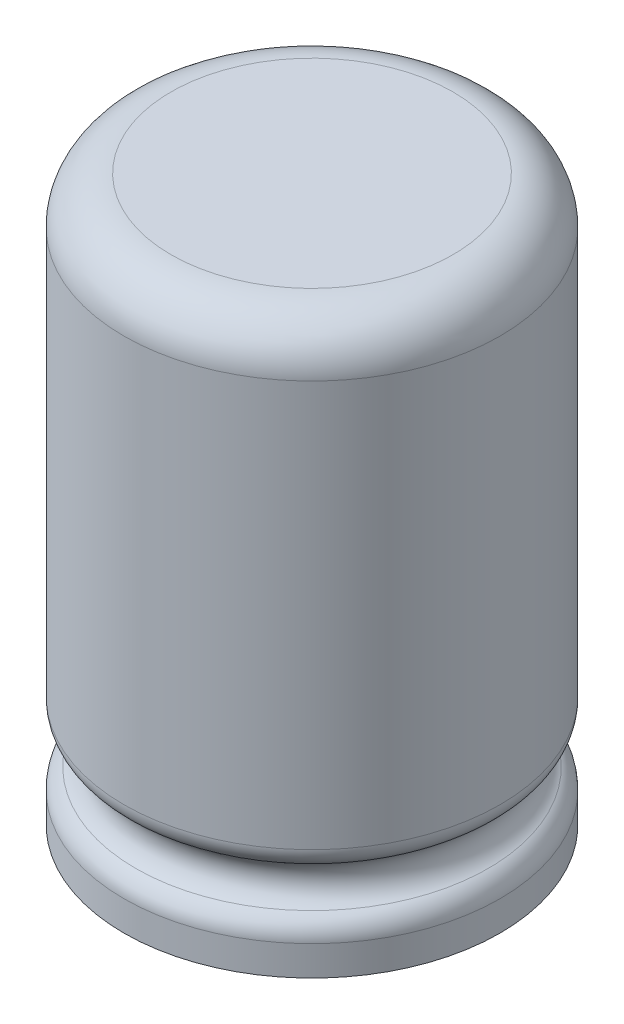
ISO-10303-21;
HEADER;
FILE_DESCRIPTION(('STEP AP214'),'2;1');
FILE_NAME('part.step','',(''),(''),'','','');
FILE_SCHEMA(('AUTOMOTIVE_DESIGN { 1 0 10303 214 1 1 1 1 }'));
ENDSEC;
DATA;
#1=APPLICATION_CONTEXT('core data for automotive mechanical design processes');
#2=APPLICATION_PROTOCOL_DEFINITION('international standard','automotive_design',2000,#1);
#3=PRODUCT_CONTEXT('',#1,'mechanical');
#4=PRODUCT('Part','Part','',(#3));
#5=PRODUCT_RELATED_PRODUCT_CATEGORY('part','',(#4));
#6=PRODUCT_DEFINITION_FORMATION('','',#4);
#7=PRODUCT_DEFINITION_CONTEXT('part definition',#1,'design');
#8=PRODUCT_DEFINITION('design','',#6,#7);
#9=PRODUCT_DEFINITION_SHAPE('','',#8);
#10=(LENGTH_UNIT() NAMED_UNIT(*) SI_UNIT(.MILLI.,.METRE.));
#11=(NAMED_UNIT(*) PLANE_ANGLE_UNIT() SI_UNIT($,.RADIAN.));
#12=(NAMED_UNIT(*) SI_UNIT($,.STERADIAN.) SOLID_ANGLE_UNIT());
#13=UNCERTAINTY_MEASURE_WITH_UNIT(LENGTH_MEASURE(1.E-05),#10,'distance_accuracy_value','');
#14=(GEOMETRIC_REPRESENTATION_CONTEXT(3) GLOBAL_UNCERTAINTY_ASSIGNED_CONTEXT((#13)) GLOBAL_UNIT_ASSIGNED_CONTEXT((#10,
#11,#12)) REPRESENTATION_CONTEXT('',''));
#15=CARTESIAN_POINT('',(0.,0.,0.));
#16=DIRECTION('',(0.,0.,1.));
#17=DIRECTION('',(1.,0.,0.));
#18=AXIS2_PLACEMENT_3D('',#15,#16,#17);
#19=CARTESIAN_POINT('',(0.,0.,0.));
#20=DIRECTION('',(0.,-1.,0.));
#21=DIRECTION('',(0.,0.,-1.));
#22=AXIS2_PLACEMENT_3D('',#19,#20,#21);
#23=PLANE('',#22);
#24=CARTESIAN_POINT('',(0.,0.,0.));
#25=DIRECTION('',(0.,-1.,0.));
#26=DIRECTION('',(0.,0.,-1.));
#27=AXIS2_PLACEMENT_3D('',#24,#25,#26);
#28=CIRCLE('',#27,4.);
#29=CARTESIAN_POINT('',(0.,0.,-4.));
#30=VERTEX_POINT('',#29);
#31=EDGE_CURVE('E51',#30,#30,#28,.T.);
#32=ORIENTED_EDGE('',*,*,#31,.T.);
#33=EDGE_LOOP('',(#32));
#34=FACE_BOUND('',#33,.T.);
#35=ADVANCED_FACE('F31',(#34),#23,.T.);
#36=CARTESIAN_POINT('',(0.,-5.13037655750242,0.));
#37=DIRECTION('',(0.,-1.,0.));
#38=DIRECTION('',(0.,0.,-1.));
#39=AXIS2_PLACEMENT_3D('',#36,#37,#38);
#40=CYLINDRICAL_SURFACE('',#39,4.);
#41=CARTESIAN_POINT('',(0.,0.63397459621534,0.));
#42=DIRECTION('',(0.,1.,0.));
#43=DIRECTION('',(0.,0.,1.));
#44=AXIS2_PLACEMENT_3D('',#41,#42,#43);
#45=CIRCLE('',#44,4.);
#46=CARTESIAN_POINT('',(0.,0.63397459621534,4.));
#47=VERTEX_POINT('',#46);
#48=EDGE_CURVE('E10',#47,#47,#45,.F.);
#49=ORIENTED_EDGE('',*,*,#48,.T.);
#50=EDGE_LOOP('',(#49));
#51=FACE_BOUND('',#50,.T.);
#52=ORIENTED_EDGE('',*,*,#31,.F.);
#53=EDGE_LOOP('',(#52));
#54=FACE_BOUND('',#53,.T.);
#55=ADVANCED_FACE('F76',(#51,#54),#40,.T.);
#56=CARTESIAN_POINT('',(0.,1.5,0.));
#57=DIRECTION('',(0.,-1.,0.));
#58=DIRECTION('',(0.,0.,-1.));
#59=AXIS2_PLACEMENT_3D('',#56,#57,#58);
#60=TOROIDAL_SURFACE('',#59,4.,0.5);
#61=CARTESIAN_POINT('',(0.,1.93301270189225,0.));
#62=DIRECTION('',(0.,-1.,0.));
#63=DIRECTION('',(0.,0.,-1.));
#64=AXIS2_PLACEMENT_3D('',#61,#62,#63);
#65=CIRCLE('',#64,3.75000000000008);
#66=CARTESIAN_POINT('',(0.,1.93301270189225,-3.75000000000008));
#67=VERTEX_POINT('',#66);
#68=EDGE_CURVE('E42',#67,#67,#65,.T.);
#69=ORIENTED_EDGE('',*,*,#68,.T.);
#70=EDGE_LOOP('',(#69));
#71=FACE_BOUND('',#70,.T.);
#72=CARTESIAN_POINT('',(0.,1.06698729810775,0.));
#73=DIRECTION('',(0.,1.,0.));
#74=DIRECTION('',(0.,0.,1.));
#75=AXIS2_PLACEMENT_3D('',#72,#73,#74);
#76=CIRCLE('',#75,3.75000000000008);
#77=CARTESIAN_POINT('',(0.,1.06698729810775,3.75000000000008));
#78=VERTEX_POINT('',#77);
#79=EDGE_CURVE('E46',#78,#78,#76,.T.);
#80=ORIENTED_EDGE('',*,*,#79,.T.);
#81=EDGE_LOOP('',(#80));
#82=FACE_BOUND('',#81,.T.);
#83=ADVANCED_FACE('F82',(#71,#82),#60,.F.);
#84=CARTESIAN_POINT('',(0.,-5.13037655750242,0.));
#85=DIRECTION('',(0.,-1.,0.));
#86=DIRECTION('',(0.,0.,-1.));
#87=AXIS2_PLACEMENT_3D('',#84,#85,#86);
#88=CYLINDRICAL_SURFACE('',#87,4.);
#89=CARTESIAN_POINT('',(0.,2.36602540378466,0.));
#90=DIRECTION('',(0.,1.,0.));
#91=DIRECTION('',(0.,0.,1.));
#92=AXIS2_PLACEMENT_3D('',#89,#90,#91);
#93=CIRCLE('',#92,4.);
#94=CARTESIAN_POINT('',(0.,2.36602540378466,4.));
#95=VERTEX_POINT('',#94);
#96=EDGE_CURVE('E38',#95,#95,#93,.T.);
#97=ORIENTED_EDGE('',*,*,#96,.T.);
#98=EDGE_LOOP('',(#97));
#99=FACE_BOUND('',#98,.T.);
#100=CARTESIAN_POINT('',(0.,11.,0.));
#101=DIRECTION('',(0.,-1.,0.));
#102=DIRECTION('',(0.,0.,-1.));
#103=AXIS2_PLACEMENT_3D('',#100,#101,#102);
#104=CIRCLE('',#103,4.);
#105=CARTESIAN_POINT('',(0.,11.,-4.));
#106=VERTEX_POINT('',#105);
#107=EDGE_CURVE('E54',#106,#106,#104,.T.);
#108=ORIENTED_EDGE('',*,*,#107,.T.);
#109=EDGE_LOOP('',(#108));
#110=FACE_BOUND('',#109,.T.);
#111=ADVANCED_FACE('F73',(#99,#110),#88,.T.);
#112=CARTESIAN_POINT('',(0.,11.,0.));
#113=DIRECTION('',(0.,-1.,0.));
#114=DIRECTION('',(0.,0.,-1.));
#115=AXIS2_PLACEMENT_3D('',#112,#113,#114);
#116=TOROIDAL_SURFACE('',#115,3.,1.);
#117=CARTESIAN_POINT('',(0.,12.,0.));
#118=DIRECTION('',(0.,-1.,0.));
#119=DIRECTION('',(0.,0.,-1.));
#120=AXIS2_PLACEMENT_3D('',#117,#118,#119);
#121=CIRCLE('',#120,2.99999999999999);
#122=CARTESIAN_POINT('',(0.,12.,-2.99999999999999));
#123=VERTEX_POINT('',#122);
#124=EDGE_CURVE('E57',#123,#123,#121,.T.);
#125=ORIENTED_EDGE('',*,*,#124,.T.);
#126=EDGE_LOOP('',(#125));
#127=FACE_BOUND('',#126,.T.);
#128=ORIENTED_EDGE('',*,*,#107,.F.);
#129=EDGE_LOOP('',(#128));
#130=FACE_BOUND('',#129,.T.);
#131=ADVANCED_FACE('F61',(#127,#130),#116,.T.);
#132=CARTESIAN_POINT('',(2.99999999999999,12.,0.));
#133=DIRECTION('',(0.,1.,0.));
#134=DIRECTION('',(0.,0.,1.));
#135=AXIS2_PLACEMENT_3D('',#132,#133,#134);
#136=PLANE('',#135);
#137=ORIENTED_EDGE('',*,*,#124,.F.);
#138=EDGE_LOOP('',(#137));
#139=FACE_BOUND('',#138,.T.);
#140=ADVANCED_FACE('F64',(#139),#136,.T.);
#141=CARTESIAN_POINT('',(0.,2.36602540378466,0.));
#142=DIRECTION('',(0.,1.,0.));
#143=DIRECTION('',(0.,0.,1.));
#144=AXIS2_PLACEMENT_3D('',#141,#142,#143);
#145=TOROIDAL_SURFACE('',#144,3.50000000000008,0.5);
#146=ORIENTED_EDGE('',*,*,#96,.F.);
#147=EDGE_LOOP('',(#146));
#148=FACE_BOUND('',#147,.T.);
#149=ORIENTED_EDGE('',*,*,#68,.F.);
#150=EDGE_LOOP('',(#149));
#151=FACE_BOUND('',#150,.T.);
#152=ADVANCED_FACE('F66',(#148,#151),#145,.T.);
#153=CARTESIAN_POINT('',(0.,0.63397459621534,0.));
#154=DIRECTION('',(0.,1.,0.));
#155=DIRECTION('',(0.,0.,1.));
#156=AXIS2_PLACEMENT_3D('',#153,#154,#155);
#157=TOROIDAL_SURFACE('',#156,3.50000000000008,0.5);
#158=ORIENTED_EDGE('',*,*,#79,.F.);
#159=EDGE_LOOP('',(#158));
#160=FACE_BOUND('',#159,.T.);
#161=ORIENTED_EDGE('',*,*,#48,.F.);
#162=EDGE_LOOP('',(#161));
#163=FACE_BOUND('',#162,.T.);
#164=ADVANCED_FACE('F33',(#160,#163),#157,.T.);
#165=CLOSED_SHELL('',(#35,#55,#83,#111,#131,#140,#152,#164));
#166=MANIFOLD_SOLID_BREP('B2',#165);
#167=ADVANCED_BREP_SHAPE_REPRESENTATION('',(#18,#166),#14);
#168=SHAPE_DEFINITION_REPRESENTATION(#9,#167);
ENDSEC;
END-ISO-10303-21;
